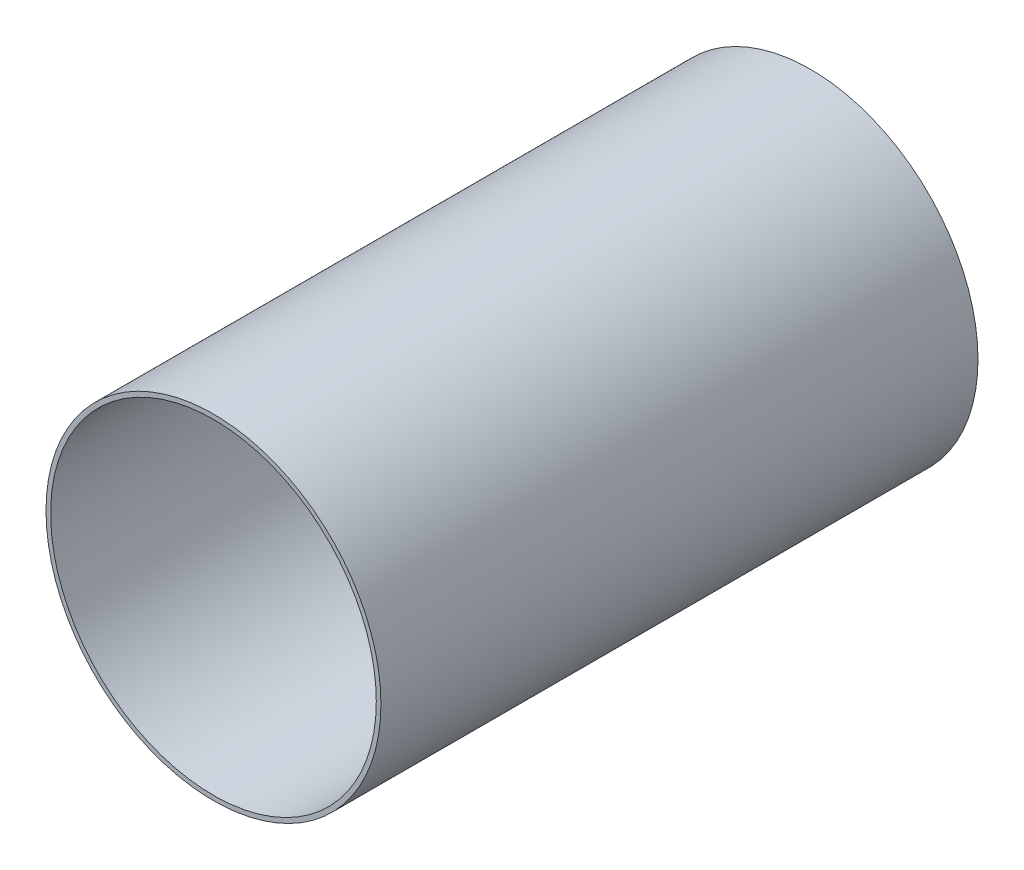
ISO-10303-21;
HEADER;
FILE_DESCRIPTION(('STEP AP214'),'2;1');
FILE_NAME('part.step','',(''),(''),'','','');
FILE_SCHEMA(('AUTOMOTIVE_DESIGN { 1 0 10303 214 1 1 1 1 }'));
ENDSEC;
DATA;
#1=APPLICATION_CONTEXT('core data for automotive mechanical design processes');
#2=APPLICATION_PROTOCOL_DEFINITION('international standard','automotive_design',2000,#1);
#3=PRODUCT_CONTEXT('',#1,'mechanical');
#4=PRODUCT('Part','Part','',(#3));
#5=PRODUCT_RELATED_PRODUCT_CATEGORY('part','',(#4));
#6=PRODUCT_DEFINITION_FORMATION('','',#4);
#7=PRODUCT_DEFINITION_CONTEXT('part definition',#1,'design');
#8=PRODUCT_DEFINITION('design','',#6,#7);
#9=PRODUCT_DEFINITION_SHAPE('','',#8);
#10=(LENGTH_UNIT() NAMED_UNIT(*) SI_UNIT(.MILLI.,.METRE.));
#11=(NAMED_UNIT(*) PLANE_ANGLE_UNIT() SI_UNIT($,.RADIAN.));
#12=(NAMED_UNIT(*) SI_UNIT($,.STERADIAN.) SOLID_ANGLE_UNIT());
#13=UNCERTAINTY_MEASURE_WITH_UNIT(LENGTH_MEASURE(1.E-05),#10,'distance_accuracy_value','');
#14=(GEOMETRIC_REPRESENTATION_CONTEXT(3) GLOBAL_UNCERTAINTY_ASSIGNED_CONTEXT((#13)) GLOBAL_UNIT_ASSIGNED_CONTEXT((#10,
#11,#12)) REPRESENTATION_CONTEXT('',''));
#15=CARTESIAN_POINT('',(0.,0.,0.));
#16=DIRECTION('',(0.,0.,1.));
#17=DIRECTION('',(1.,0.,0.));
#18=AXIS2_PLACEMENT_3D('',#15,#16,#17);
#19=CARTESIAN_POINT('',(0.,0.,279.4));
#20=DIRECTION('',(0.,0.,1.));
#21=DIRECTION('',(1.,0.,0.));
#22=AXIS2_PLACEMENT_3D('',#19,#20,#21);
#23=PLANE('',#22);
#24=CARTESIAN_POINT('',(0.,0.,279.4));
#25=DIRECTION('',(0.,0.,1.));
#26=DIRECTION('',(1.,0.,0.));
#27=AXIS2_PLACEMENT_3D('',#24,#25,#26);
#28=CIRCLE('',#27,78.359);
#29=CARTESIAN_POINT('',(78.359,0.,279.4));
#30=VERTEX_POINT('',#29);
#31=EDGE_CURVE('E10',#30,#30,#28,.T.);
#32=ORIENTED_EDGE('',*,*,#31,.T.);
#33=EDGE_LOOP('',(#32));
#34=FACE_BOUND('',#33,.T.);
#35=CARTESIAN_POINT('',(0.,0.,279.4));
#36=DIRECTION('',(0.,0.,1.));
#37=DIRECTION('',(1.,0.,0.));
#38=AXIS2_PLACEMENT_3D('',#35,#36,#37);
#39=CIRCLE('',#38,76.2);
#40=CARTESIAN_POINT('',(76.2,0.,279.4));
#41=VERTEX_POINT('',#40);
#42=EDGE_CURVE('E44',#41,#41,#39,.T.);
#43=ORIENTED_EDGE('',*,*,#42,.F.);
#44=EDGE_LOOP('',(#43));
#45=FACE_BOUND('',#44,.T.);
#46=ADVANCED_FACE('F33',(#34,#45),#23,.T.);
#47=CARTESIAN_POINT('',(0.,0.,0.));
#48=DIRECTION('',(0.,0.,1.));
#49=DIRECTION('',(1.,0.,0.));
#50=AXIS2_PLACEMENT_3D('',#47,#48,#49);
#51=PLANE('',#50);
#52=CARTESIAN_POINT('',(0.,0.,0.));
#53=DIRECTION('',(0.,0.,1.));
#54=DIRECTION('',(1.,0.,0.));
#55=AXIS2_PLACEMENT_3D('',#52,#53,#54);
#56=CIRCLE('',#55,78.359);
#57=CARTESIAN_POINT('',(78.359,0.,0.));
#58=VERTEX_POINT('',#57);
#59=EDGE_CURVE('E37',#58,#58,#56,.T.);
#60=ORIENTED_EDGE('',*,*,#59,.F.);
#61=EDGE_LOOP('',(#60));
#62=FACE_BOUND('',#61,.T.);
#63=CARTESIAN_POINT('',(0.,0.,0.));
#64=DIRECTION('',(0.,0.,1.));
#65=DIRECTION('',(1.,0.,0.));
#66=AXIS2_PLACEMENT_3D('',#63,#64,#65);
#67=CIRCLE('',#66,76.2);
#68=CARTESIAN_POINT('',(76.2,0.,0.));
#69=VERTEX_POINT('',#68);
#70=EDGE_CURVE('E46',#69,#69,#67,.T.);
#71=ORIENTED_EDGE('',*,*,#70,.T.);
#72=EDGE_LOOP('',(#71));
#73=FACE_BOUND('',#72,.T.);
#74=ADVANCED_FACE('F56',(#62,#73),#51,.F.);
#75=CARTESIAN_POINT('',(0.,0.,279.4));
#76=DIRECTION('',(0.,0.,-1.));
#77=DIRECTION('',(-1.,0.,0.));
#78=AXIS2_PLACEMENT_3D('',#75,#76,#77);
#79=CYLINDRICAL_SURFACE('',#78,78.359);
#80=ORIENTED_EDGE('',*,*,#31,.F.);
#81=EDGE_LOOP('',(#80));
#82=FACE_BOUND('',#81,.T.);
#83=ORIENTED_EDGE('',*,*,#59,.T.);
#84=EDGE_LOOP('',(#83));
#85=FACE_BOUND('',#84,.T.);
#86=ADVANCED_FACE('F35',(#82,#85),#79,.T.);
#87=CARTESIAN_POINT('',(0.,0.,279.4));
#88=DIRECTION('',(0.,0.,-1.));
#89=DIRECTION('',(-1.,0.,0.));
#90=AXIS2_PLACEMENT_3D('',#87,#88,#89);
#91=CYLINDRICAL_SURFACE('',#90,76.2);
#92=ORIENTED_EDGE('',*,*,#42,.T.);
#93=EDGE_LOOP('',(#92));
#94=FACE_BOUND('',#93,.T.);
#95=ORIENTED_EDGE('',*,*,#70,.F.);
#96=EDGE_LOOP('',(#95));
#97=FACE_BOUND('',#96,.T.);
#98=ADVANCED_FACE('F52',(#94,#97),#91,.F.);
#99=CLOSED_SHELL('',(#46,#74,#86,#98));
#100=MANIFOLD_SOLID_BREP('B2',#99);
#101=ADVANCED_BREP_SHAPE_REPRESENTATION('',(#18,#100),#14);
#102=SHAPE_DEFINITION_REPRESENTATION(#9,#101);
ENDSEC;
END-ISO-10303-21;
